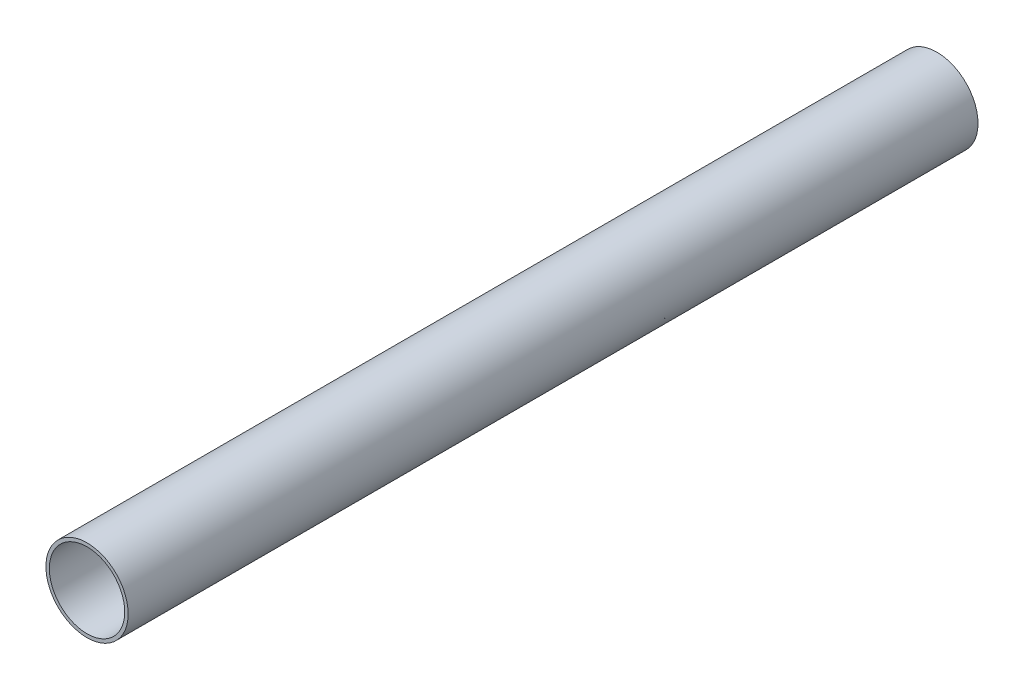
ISO-10303-21;
HEADER;
FILE_DESCRIPTION(('STEP AP214'),'2;1');
FILE_NAME('part.step','',(''),(''),'','','');
FILE_SCHEMA(('AUTOMOTIVE_DESIGN { 1 0 10303 214 1 1 1 1 }'));
ENDSEC;
DATA;
#1=APPLICATION_CONTEXT('core data for automotive mechanical design processes');
#2=APPLICATION_PROTOCOL_DEFINITION('international standard','automotive_design',2000,#1);
#3=PRODUCT_CONTEXT('',#1,'mechanical');
#4=PRODUCT('Part','Part','',(#3));
#5=PRODUCT_RELATED_PRODUCT_CATEGORY('part','',(#4));
#6=PRODUCT_DEFINITION_FORMATION('','',#4);
#7=PRODUCT_DEFINITION_CONTEXT('part definition',#1,'design');
#8=PRODUCT_DEFINITION('design','',#6,#7);
#9=PRODUCT_DEFINITION_SHAPE('','',#8);
#10=(LENGTH_UNIT() NAMED_UNIT(*) SI_UNIT(.MILLI.,.METRE.));
#11=(NAMED_UNIT(*) PLANE_ANGLE_UNIT() SI_UNIT($,.RADIAN.));
#12=(NAMED_UNIT(*) SI_UNIT($,.STERADIAN.) SOLID_ANGLE_UNIT());
#13=UNCERTAINTY_MEASURE_WITH_UNIT(LENGTH_MEASURE(1.E-05),#10,'distance_accuracy_value','');
#14=(GEOMETRIC_REPRESENTATION_CONTEXT(3) GLOBAL_UNCERTAINTY_ASSIGNED_CONTEXT((#13)) GLOBAL_UNIT_ASSIGNED_CONTEXT((#10,
#11,#12)) REPRESENTATION_CONTEXT('',''));
#15=CARTESIAN_POINT('',(0.,0.,0.));
#16=DIRECTION('',(0.,0.,1.));
#17=DIRECTION('',(1.,0.,0.));
#18=AXIS2_PLACEMENT_3D('',#15,#16,#17);
#19=CARTESIAN_POINT('',(0.,0.,62.));
#20=DIRECTION('',(0.,0.,-1.));
#21=DIRECTION('',(-1.,0.,0.));
#22=AXIS2_PLACEMENT_3D('',#19,#20,#21);
#23=CYLINDRICAL_SURFACE('',#22,3.);
#24=CARTESIAN_POINT('',(0.,0.,62.));
#25=DIRECTION('',(0.,0.,1.));
#26=DIRECTION('',(1.,0.,0.));
#27=AXIS2_PLACEMENT_3D('',#24,#25,#26);
#28=CIRCLE('',#27,3.);
#29=CARTESIAN_POINT('',(3.,0.,62.));
#30=VERTEX_POINT('',#29);
#31=EDGE_CURVE('E10',#30,#30,#28,.T.);
#32=ORIENTED_EDGE('',*,*,#31,.F.);
#33=EDGE_LOOP('',(#32));
#34=FACE_BOUND('',#33,.T.);
#35=CARTESIAN_POINT('',(0.,0.,0.));
#36=DIRECTION('',(0.,0.,1.));
#37=DIRECTION('',(1.,0.,0.));
#38=AXIS2_PLACEMENT_3D('',#35,#36,#37);
#39=CIRCLE('',#38,3.);
#40=CARTESIAN_POINT('',(3.,0.,0.));
#41=VERTEX_POINT('',#40);
#42=EDGE_CURVE('E36',#41,#41,#39,.T.);
#43=ORIENTED_EDGE('',*,*,#42,.T.);
#44=EDGE_LOOP('',(#43));
#45=FACE_BOUND('',#44,.T.);
#46=ADVANCED_FACE('F33',(#34,#45),#23,.T.);
#47=CARTESIAN_POINT('',(0.,0.,62.));
#48=DIRECTION('',(0.,0.,1.));
#49=DIRECTION('',(1.,0.,0.));
#50=AXIS2_PLACEMENT_3D('',#47,#48,#49);
#51=PLANE('',#50);
#52=CARTESIAN_POINT('',(0.,0.,62.));
#53=DIRECTION('',(0.,0.,1.));
#54=DIRECTION('',(1.,0.,0.));
#55=AXIS2_PLACEMENT_3D('',#52,#53,#54);
#56=CIRCLE('',#55,2.75);
#57=CARTESIAN_POINT('',(2.75,0.,62.));
#58=VERTEX_POINT('',#57);
#59=EDGE_CURVE('E43',#58,#58,#56,.T.);
#60=ORIENTED_EDGE('',*,*,#59,.F.);
#61=EDGE_LOOP('',(#60));
#62=FACE_BOUND('',#61,.T.);
#63=ORIENTED_EDGE('',*,*,#31,.T.);
#64=EDGE_LOOP('',(#63));
#65=FACE_BOUND('',#64,.T.);
#66=ADVANCED_FACE('F56',(#62,#65),#51,.T.);
#67=CARTESIAN_POINT('',(0.,0.,0.));
#68=DIRECTION('',(0.,0.,1.));
#69=DIRECTION('',(1.,0.,0.));
#70=AXIS2_PLACEMENT_3D('',#67,#68,#69);
#71=PLANE('',#70);
#72=CARTESIAN_POINT('',(0.,0.,0.));
#73=DIRECTION('',(0.,0.,-1.));
#74=DIRECTION('',(-1.,0.,0.));
#75=AXIS2_PLACEMENT_3D('',#72,#73,#74);
#76=CIRCLE('',#75,2.75);
#77=CARTESIAN_POINT('',(-2.75,0.,0.));
#78=VERTEX_POINT('',#77);
#79=EDGE_CURVE('E47',#78,#78,#76,.T.);
#80=ORIENTED_EDGE('',*,*,#79,.F.);
#81=EDGE_LOOP('',(#80));
#82=FACE_BOUND('',#81,.T.);
#83=ORIENTED_EDGE('',*,*,#42,.F.);
#84=EDGE_LOOP('',(#83));
#85=FACE_BOUND('',#84,.T.);
#86=ADVANCED_FACE('F53',(#82,#85),#71,.F.);
#87=CARTESIAN_POINT('',(0.,0.,75.));
#88=DIRECTION('',(0.,0.,-1.));
#89=DIRECTION('',(-1.,0.,0.));
#90=AXIS2_PLACEMENT_3D('',#87,#88,#89);
#91=CYLINDRICAL_SURFACE('',#90,2.75);
#92=ORIENTED_EDGE('',*,*,#59,.T.);
#93=EDGE_LOOP('',(#92));
#94=FACE_BOUND('',#93,.T.);
#95=ORIENTED_EDGE('',*,*,#79,.T.);
#96=EDGE_LOOP('',(#95));
#97=FACE_BOUND('',#96,.T.);
#98=ADVANCED_FACE('F51',(#94,#97),#91,.F.);
#99=CLOSED_SHELL('',(#46,#66,#86,#98));
#100=MANIFOLD_SOLID_BREP('B2',#99);
#101=ADVANCED_BREP_SHAPE_REPRESENTATION('',(#18,#100),#14);
#102=SHAPE_DEFINITION_REPRESENTATION(#9,#101);
ENDSEC;
END-ISO-10303-21;
